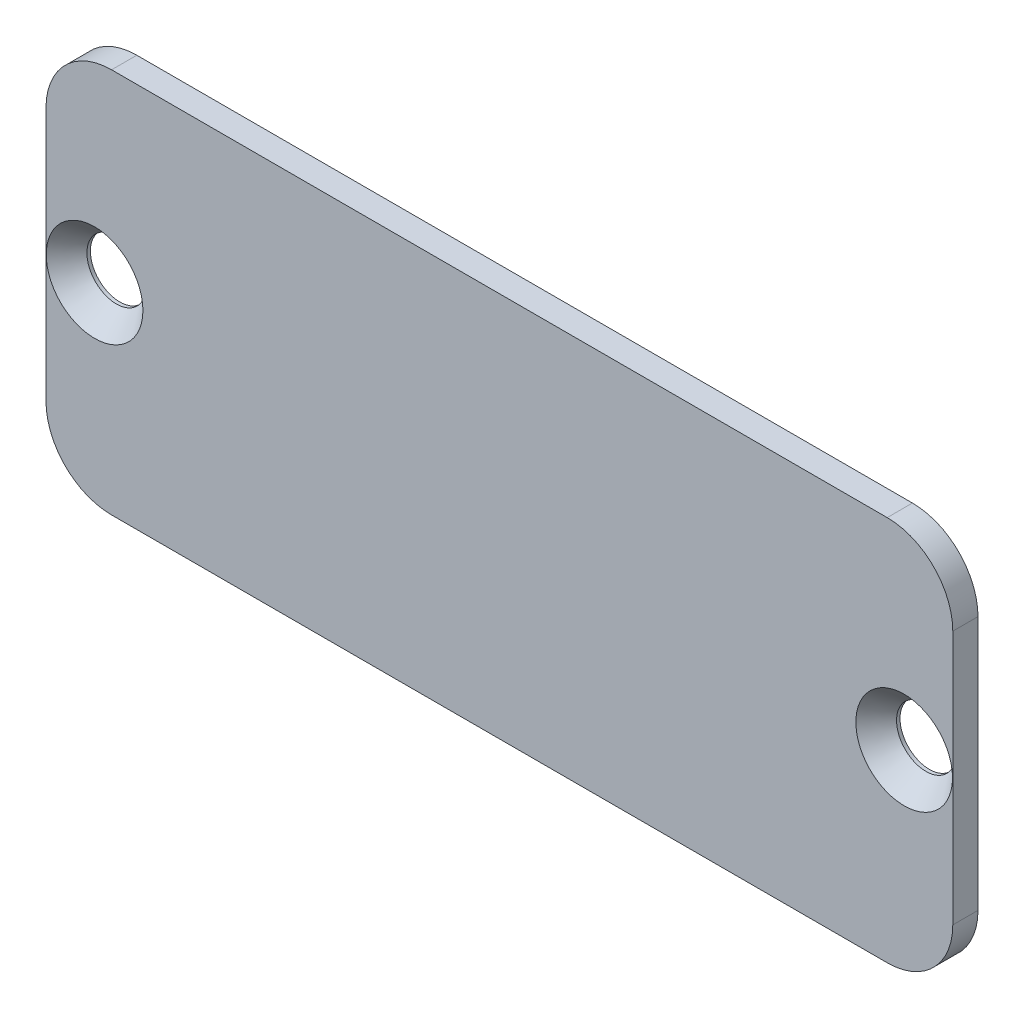
ISO-10303-21;
HEADER;
FILE_DESCRIPTION(('STEP AP214'),'2;1');
FILE_NAME('part.step','',(''),(''),'','','');
FILE_SCHEMA(('AUTOMOTIVE_DESIGN { 1 0 10303 214 1 1 1 1 }'));
ENDSEC;
DATA;
#1=APPLICATION_CONTEXT('core data for automotive mechanical design processes');
#2=APPLICATION_PROTOCOL_DEFINITION('international standard','automotive_design',2000,#1);
#3=PRODUCT_CONTEXT('',#1,'mechanical');
#4=PRODUCT('Part','Part','',(#3));
#5=PRODUCT_RELATED_PRODUCT_CATEGORY('part','',(#4));
#6=PRODUCT_DEFINITION_FORMATION('','',#4);
#7=PRODUCT_DEFINITION_CONTEXT('part definition',#1,'design');
#8=PRODUCT_DEFINITION('design','',#6,#7);
#9=PRODUCT_DEFINITION_SHAPE('','',#8);
#10=(LENGTH_UNIT() NAMED_UNIT(*) SI_UNIT(.MILLI.,.METRE.));
#11=(NAMED_UNIT(*) PLANE_ANGLE_UNIT() SI_UNIT($,.RADIAN.));
#12=(NAMED_UNIT(*) SI_UNIT($,.STERADIAN.) SOLID_ANGLE_UNIT());
#13=UNCERTAINTY_MEASURE_WITH_UNIT(LENGTH_MEASURE(1.E-05),#10,'distance_accuracy_value','');
#14=(GEOMETRIC_REPRESENTATION_CONTEXT(3) GLOBAL_UNCERTAINTY_ASSIGNED_CONTEXT((#13)) GLOBAL_UNIT_ASSIGNED_CONTEXT((#10,
#11,#12)) REPRESENTATION_CONTEXT('',''));
#15=CARTESIAN_POINT('',(0.,0.,0.));
#16=DIRECTION('',(0.,0.,1.));
#17=DIRECTION('',(1.,0.,0.));
#18=AXIS2_PLACEMENT_3D('',#15,#16,#17);
#19=CARTESIAN_POINT('',(0.,0.,1.49999999999999));
#20=DIRECTION('',(0.,0.,1.));
#21=DIRECTION('',(1.,0.,0.));
#22=AXIS2_PLACEMENT_3D('',#19,#20,#21);
#23=PLANE('',#22);
#24=CARTESIAN_POINT('',(24.0755,0.,1.50000000041928));
#25=DIRECTION('',(0.,0.,1.));
#26=DIRECTION('',(1.,0.,0.));
#27=AXIS2_PLACEMENT_3D('',#24,#25,#26);
#28=CIRCLE('',#27,2.87499999954334);
#29=CARTESIAN_POINT('',(26.9504999995434,0.,1.50000000041928));
#30=VERTEX_POINT('',#29);
#31=EDGE_CURVE('E100',#30,#30,#28,.F.);
#32=ORIENTED_EDGE('',*,*,#31,.T.);
#33=EDGE_LOOP('',(#32));
#34=FACE_BOUND('',#33,.T.);
#35=CARTESIAN_POINT('',(-24.0755,0.,1.50000000041928));
#36=DIRECTION('',(0.,0.,1.));
#37=DIRECTION('',(1.,0.,0.));
#38=AXIS2_PLACEMENT_3D('',#35,#36,#37);
#39=CIRCLE('',#38,2.87499999952489);
#40=CARTESIAN_POINT('',(-21.2005000004751,0.,1.50000000041928));
#41=VERTEX_POINT('',#40);
#42=EDGE_CURVE('E18',#41,#41,#39,.F.);
#43=ORIENTED_EDGE('',*,*,#42,.T.);
#44=EDGE_LOOP('',(#43));
#45=FACE_BOUND('',#44,.T.);
#46=DIRECTION('',(0.,1.,0.));
#47=VECTOR('',#46,1.);
#48=CARTESIAN_POINT('',(26.965,7.56500000000002,1.49999999999999));
#49=LINE('',#48,#47);
#50=CARTESIAN_POINT('',(26.965,7.56500000000002,1.49999999999999));
#51=VERTEX_POINT('',#50);
#52=CARTESIAN_POINT('',(26.965,-7.56500000000002,1.49999999999999));
#53=VERTEX_POINT('',#52);
#54=EDGE_CURVE('E114',#51,#53,#49,.F.);
#55=ORIENTED_EDGE('',*,*,#54,.F.);
#56=CARTESIAN_POINT('',(23.065,7.56500000000002,1.49999999999999));
#57=DIRECTION('',(0.,0.,1.));
#58=DIRECTION('',(1.,0.,0.));
#59=AXIS2_PLACEMENT_3D('',#56,#57,#58);
#60=CIRCLE('',#59,3.9);
#61=CARTESIAN_POINT('',(23.065,11.465,1.49999999999999));
#62=VERTEX_POINT('',#61);
#63=EDGE_CURVE('E134',#62,#51,#60,.F.);
#64=ORIENTED_EDGE('',*,*,#63,.F.);
#65=DIRECTION('',(1.,0.,0.));
#66=VECTOR('',#65,1.);
#67=CARTESIAN_POINT('',(0.,11.465,1.49999999999999));
#68=LINE('',#67,#66);
#69=CARTESIAN_POINT('',(-23.065,11.465,1.49999999999999));
#70=VERTEX_POINT('',#69);
#71=EDGE_CURVE('E110',#70,#62,#68,.T.);
#72=ORIENTED_EDGE('',*,*,#71,.F.);
#73=CARTESIAN_POINT('',(-23.065,7.56500000000002,1.49999999999999));
#74=DIRECTION('',(0.,0.,1.));
#75=DIRECTION('',(1.,0.,0.));
#76=AXIS2_PLACEMENT_3D('',#73,#74,#75);
#77=CIRCLE('',#76,3.9);
#78=CARTESIAN_POINT('',(-26.965,7.56500000000002,1.49999999999999));
#79=VERTEX_POINT('',#78);
#80=EDGE_CURVE('E96',#79,#70,#77,.F.);
#81=ORIENTED_EDGE('',*,*,#80,.F.);
#82=DIRECTION('',(0.,1.,0.));
#83=VECTOR('',#82,1.);
#84=CARTESIAN_POINT('',(-26.965,0.,1.49999999999999));
#85=LINE('',#84,#83);
#86=CARTESIAN_POINT('',(-26.965,-7.56500000000002,1.49999999999999));
#87=VERTEX_POINT('',#86);
#88=EDGE_CURVE('E91',#87,#79,#85,.T.);
#89=ORIENTED_EDGE('',*,*,#88,.F.);
#90=CARTESIAN_POINT('',(-23.065,-7.56500000000002,1.49999999999999));
#91=DIRECTION('',(0.,0.,1.));
#92=DIRECTION('',(1.,0.,0.));
#93=AXIS2_PLACEMENT_3D('',#90,#91,#92);
#94=CIRCLE('',#93,3.9);
#95=CARTESIAN_POINT('',(-23.065,-11.465,1.49999999999999));
#96=VERTEX_POINT('',#95);
#97=EDGE_CURVE('E82',#96,#87,#94,.F.);
#98=ORIENTED_EDGE('',*,*,#97,.F.);
#99=DIRECTION('',(1.,0.,0.));
#100=VECTOR('',#99,1.);
#101=CARTESIAN_POINT('',(23.065,-11.465,1.49999999999999));
#102=LINE('',#101,#100);
#103=CARTESIAN_POINT('',(23.065,-11.465,1.49999999999999));
#104=VERTEX_POINT('',#103);
#105=EDGE_CURVE('E77',#104,#96,#102,.F.);
#106=ORIENTED_EDGE('',*,*,#105,.F.);
#107=CARTESIAN_POINT('',(23.065,-7.56500000000002,1.49999999999999));
#108=DIRECTION('',(0.,0.,1.));
#109=DIRECTION('',(1.,0.,0.));
#110=AXIS2_PLACEMENT_3D('',#107,#108,#109);
#111=CIRCLE('',#110,3.9);
#112=EDGE_CURVE('E136',#53,#104,#111,.F.);
#113=ORIENTED_EDGE('',*,*,#112,.F.);
#114=EDGE_LOOP('',(#55,#64,#72,#81,#89,#98,#106,#113));
#115=FACE_BOUND('',#114,.T.);
#116=ADVANCED_FACE('F15',(#34,#45,#115),#23,.T.);
#117=CARTESIAN_POINT('',(-24.0755,0.,1.50000000041928));
#118=DIRECTION('',(0.,0.,1.));
#119=DIRECTION('',(1.,0.,0.));
#120=AXIS2_PLACEMENT_3D('',#117,#118,#119);
#121=CONICAL_SURFACE('',#120,2.87499999952489,0.715584992503476);
#122=CARTESIAN_POINT('',(-24.0755,0.,0.205835541876351));
#123=DIRECTION('',(0.,0.,1.));
#124=DIRECTION('',(1.,0.,0.));
#125=AXIS2_PLACEMENT_3D('',#122,#123,#124);
#126=CIRCLE('',#125,1.75000000000001);
#127=CARTESIAN_POINT('',(-22.3255,0.,0.205835541876351));
#128=VERTEX_POINT('',#127);
#129=EDGE_CURVE('E297',#128,#128,#126,.F.);
#130=ORIENTED_EDGE('',*,*,#129,.T.);
#131=EDGE_LOOP('',(#130));
#132=FACE_BOUND('',#131,.T.);
#133=ORIENTED_EDGE('',*,*,#42,.F.);
#134=EDGE_LOOP('',(#133));
#135=FACE_BOUND('',#134,.T.);
#136=ADVANCED_FACE('F144',(#132,#135),#121,.F.);
#137=CARTESIAN_POINT('',(24.0755,0.,1.50000000041928));
#138=DIRECTION('',(0.,0.,1.));
#139=DIRECTION('',(1.,0.,0.));
#140=AXIS2_PLACEMENT_3D('',#137,#138,#139);
#141=CONICAL_SURFACE('',#140,2.87499999954334,0.715584992503476);
#142=CARTESIAN_POINT('',(24.0755,0.,0.205835541876351));
#143=DIRECTION('',(0.,0.,1.));
#144=DIRECTION('',(1.,0.,0.));
#145=AXIS2_PLACEMENT_3D('',#142,#143,#144);
#146=CIRCLE('',#145,1.75000000000001);
#147=CARTESIAN_POINT('',(25.8255,0.,0.205835541876351));
#148=VERTEX_POINT('',#147);
#149=EDGE_CURVE('E294',#148,#148,#146,.F.);
#150=ORIENTED_EDGE('',*,*,#149,.T.);
#151=EDGE_LOOP('',(#150));
#152=FACE_BOUND('',#151,.T.);
#153=ORIENTED_EDGE('',*,*,#31,.F.);
#154=EDGE_LOOP('',(#153));
#155=FACE_BOUND('',#154,.T.);
#156=ADVANCED_FACE('F146',(#152,#155),#141,.F.);
#157=CARTESIAN_POINT('',(-26.965,0.,0.));
#158=DIRECTION('',(-1.,0.,0.));
#159=DIRECTION('',(0.,0.,1.));
#160=AXIS2_PLACEMENT_3D('',#157,#158,#159);
#161=PLANE('',#160);
#162=DIRECTION('',(0.,1.,0.));
#163=VECTOR('',#162,1.);
#164=CARTESIAN_POINT('',(-26.965,0.,0.));
#165=LINE('',#164,#163);
#166=CARTESIAN_POINT('',(-26.965,7.56500000000002,0.));
#167=VERTEX_POINT('',#166);
#168=CARTESIAN_POINT('',(-26.965,-7.56500000000002,0.));
#169=VERTEX_POINT('',#168);
#170=EDGE_CURVE('E104',#167,#169,#165,.F.);
#171=ORIENTED_EDGE('',*,*,#170,.T.);
#172=DIRECTION('',(0.,0.,1.));
#173=VECTOR('',#172,1.);
#174=CARTESIAN_POINT('',(-26.965,-7.56500000000002,0.));
#175=LINE('',#174,#173);
#176=EDGE_CURVE('E87',#87,#169,#175,.F.);
#177=ORIENTED_EDGE('',*,*,#176,.F.);
#178=ORIENTED_EDGE('',*,*,#88,.T.);
#179=DIRECTION('',(0.,0.,1.));
#180=VECTOR('',#179,1.);
#181=CARTESIAN_POINT('',(-26.965,7.56500000000002,0.));
#182=LINE('',#181,#180);
#183=EDGE_CURVE('E301',#167,#79,#182,.T.);
#184=ORIENTED_EDGE('',*,*,#183,.F.);
#185=EDGE_LOOP('',(#171,#177,#178,#184));
#186=FACE_BOUND('',#185,.T.);
#187=ADVANCED_FACE('F103',(#186),#161,.T.);
#188=CARTESIAN_POINT('',(-23.065,-7.56500000000002,0.));
#189=DIRECTION('',(0.,0.,1.));
#190=DIRECTION('',(1.,0.,0.));
#191=AXIS2_PLACEMENT_3D('',#188,#189,#190);
#192=CYLINDRICAL_SURFACE('',#191,3.9);
#193=CARTESIAN_POINT('',(-23.065,-7.56500000000002,0.));
#194=DIRECTION('',(0.,0.,1.));
#195=DIRECTION('',(1.,0.,0.));
#196=AXIS2_PLACEMENT_3D('',#193,#194,#195);
#197=CIRCLE('',#196,3.9);
#198=CARTESIAN_POINT('',(-23.065,-11.465,0.));
#199=VERTEX_POINT('',#198);
#200=EDGE_CURVE('E131',#169,#199,#197,.T.);
#201=ORIENTED_EDGE('',*,*,#200,.T.);
#202=DIRECTION('',(0.,0.,-1.));
#203=VECTOR('',#202,1.);
#204=CARTESIAN_POINT('',(-23.065,-11.465,0.));
#205=LINE('',#204,#203);
#206=EDGE_CURVE('E89',#96,#199,#205,.T.);
#207=ORIENTED_EDGE('',*,*,#206,.F.);
#208=ORIENTED_EDGE('',*,*,#97,.T.);
#209=ORIENTED_EDGE('',*,*,#176,.T.);
#210=EDGE_LOOP('',(#201,#207,#208,#209));
#211=FACE_BOUND('',#210,.T.);
#212=ADVANCED_FACE('F85',(#211),#192,.T.);
#213=CARTESIAN_POINT('',(23.065,-11.465,0.));
#214=DIRECTION('',(0.,-1.,0.));
#215=DIRECTION('',(0.,0.,-1.));
#216=AXIS2_PLACEMENT_3D('',#213,#214,#215);
#217=PLANE('',#216);
#218=DIRECTION('',(1.,0.,0.));
#219=VECTOR('',#218,1.);
#220=CARTESIAN_POINT('',(0.,-11.465,0.));
#221=LINE('',#220,#219);
#222=CARTESIAN_POINT('',(23.065,-11.465,0.));
#223=VERTEX_POINT('',#222);
#224=EDGE_CURVE('E130',#199,#223,#221,.T.);
#225=ORIENTED_EDGE('',*,*,#224,.T.);
#226=DIRECTION('',(0.,0.,1.));
#227=VECTOR('',#226,1.);
#228=CARTESIAN_POINT('',(23.065,-11.465,0.));
#229=LINE('',#228,#227);
#230=EDGE_CURVE('E116',#104,#223,#229,.F.);
#231=ORIENTED_EDGE('',*,*,#230,.F.);
#232=ORIENTED_EDGE('',*,*,#105,.T.);
#233=ORIENTED_EDGE('',*,*,#206,.T.);
#234=EDGE_LOOP('',(#225,#231,#232,#233));
#235=FACE_BOUND('',#234,.T.);
#236=ADVANCED_FACE('F191',(#235),#217,.T.);
#237=CARTESIAN_POINT('',(23.065,-7.56500000000002,0.));
#238=DIRECTION('',(0.,0.,1.));
#239=DIRECTION('',(1.,0.,0.));
#240=AXIS2_PLACEMENT_3D('',#237,#238,#239);
#241=CYLINDRICAL_SURFACE('',#240,3.9);
#242=CARTESIAN_POINT('',(23.065,-7.56500000000002,0.));
#243=DIRECTION('',(0.,0.,1.));
#244=DIRECTION('',(1.,0.,0.));
#245=AXIS2_PLACEMENT_3D('',#242,#243,#244);
#246=CIRCLE('',#245,3.9);
#247=CARTESIAN_POINT('',(26.965,-7.56500000000002,0.));
#248=VERTEX_POINT('',#247);
#249=EDGE_CURVE('E127',#223,#248,#246,.T.);
#250=ORIENTED_EDGE('',*,*,#249,.T.);
#251=DIRECTION('',(0.,0.,-1.));
#252=VECTOR('',#251,1.);
#253=CARTESIAN_POINT('',(26.965,-7.56500000000002,0.));
#254=LINE('',#253,#252);
#255=EDGE_CURVE('E115',#53,#248,#254,.T.);
#256=ORIENTED_EDGE('',*,*,#255,.F.);
#257=ORIENTED_EDGE('',*,*,#112,.T.);
#258=ORIENTED_EDGE('',*,*,#230,.T.);
#259=EDGE_LOOP('',(#250,#256,#257,#258));
#260=FACE_BOUND('',#259,.T.);
#261=ADVANCED_FACE('F187',(#260),#241,.T.);
#262=CARTESIAN_POINT('',(26.965,7.56500000000002,0.));
#263=DIRECTION('',(1.,0.,0.));
#264=DIRECTION('',(0.,0.,-1.));
#265=AXIS2_PLACEMENT_3D('',#262,#263,#264);
#266=PLANE('',#265);
#267=DIRECTION('',(0.,1.,0.));
#268=VECTOR('',#267,1.);
#269=CARTESIAN_POINT('',(26.965,0.,0.));
#270=LINE('',#269,#268);
#271=CARTESIAN_POINT('',(26.965,7.56500000000002,0.));
#272=VERTEX_POINT('',#271);
#273=EDGE_CURVE('E126',#248,#272,#270,.T.);
#274=ORIENTED_EDGE('',*,*,#273,.T.);
#275=DIRECTION('',(0.,0.,1.));
#276=VECTOR('',#275,1.);
#277=CARTESIAN_POINT('',(26.965,7.56500000000002,0.));
#278=LINE('',#277,#276);
#279=EDGE_CURVE('E113',#51,#272,#278,.F.);
#280=ORIENTED_EDGE('',*,*,#279,.F.);
#281=ORIENTED_EDGE('',*,*,#54,.T.);
#282=ORIENTED_EDGE('',*,*,#255,.T.);
#283=EDGE_LOOP('',(#274,#280,#281,#282));
#284=FACE_BOUND('',#283,.T.);
#285=ADVANCED_FACE('F183',(#284),#266,.T.);
#286=CARTESIAN_POINT('',(23.065,7.56500000000002,0.));
#287=DIRECTION('',(0.,0.,1.));
#288=DIRECTION('',(1.,0.,0.));
#289=AXIS2_PLACEMENT_3D('',#286,#287,#288);
#290=CYLINDRICAL_SURFACE('',#289,3.9);
#291=CARTESIAN_POINT('',(23.065,7.56500000000002,0.));
#292=DIRECTION('',(0.,0.,1.));
#293=DIRECTION('',(1.,0.,0.));
#294=AXIS2_PLACEMENT_3D('',#291,#292,#293);
#295=CIRCLE('',#294,3.9);
#296=CARTESIAN_POINT('',(23.065,11.465,0.));
#297=VERTEX_POINT('',#296);
#298=EDGE_CURVE('E123',#272,#297,#295,.T.);
#299=ORIENTED_EDGE('',*,*,#298,.T.);
#300=DIRECTION('',(0.,0.,1.));
#301=VECTOR('',#300,1.);
#302=CARTESIAN_POINT('',(23.065,11.465,0.));
#303=LINE('',#302,#301);
#304=EDGE_CURVE('E112',#62,#297,#303,.F.);
#305=ORIENTED_EDGE('',*,*,#304,.F.);
#306=ORIENTED_EDGE('',*,*,#63,.T.);
#307=ORIENTED_EDGE('',*,*,#279,.T.);
#308=EDGE_LOOP('',(#299,#305,#306,#307));
#309=FACE_BOUND('',#308,.T.);
#310=ADVANCED_FACE('F179',(#309),#290,.T.);
#311=CARTESIAN_POINT('',(0.,11.465,0.));
#312=DIRECTION('',(0.,1.,0.));
#313=DIRECTION('',(0.,0.,1.));
#314=AXIS2_PLACEMENT_3D('',#311,#312,#313);
#315=PLANE('',#314);
#316=DIRECTION('',(1.,0.,0.));
#317=VECTOR('',#316,1.);
#318=CARTESIAN_POINT('',(0.,11.465,0.));
#319=LINE('',#318,#317);
#320=CARTESIAN_POINT('',(-23.065,11.465,0.));
#321=VERTEX_POINT('',#320);
#322=EDGE_CURVE('E122',#297,#321,#319,.F.);
#323=ORIENTED_EDGE('',*,*,#322,.T.);
#324=DIRECTION('',(0.,0.,1.));
#325=VECTOR('',#324,1.);
#326=CARTESIAN_POINT('',(-23.065,11.465,0.));
#327=LINE('',#326,#325);
#328=EDGE_CURVE('E33',#70,#321,#327,.F.);
#329=ORIENTED_EDGE('',*,*,#328,.F.);
#330=ORIENTED_EDGE('',*,*,#71,.T.);
#331=ORIENTED_EDGE('',*,*,#304,.T.);
#332=EDGE_LOOP('',(#323,#329,#330,#331));
#333=FACE_BOUND('',#332,.T.);
#334=ADVANCED_FACE('F176',(#333),#315,.T.);
#335=CARTESIAN_POINT('',(-23.065,7.56500000000002,0.));
#336=DIRECTION('',(0.,0.,1.));
#337=DIRECTION('',(1.,0.,0.));
#338=AXIS2_PLACEMENT_3D('',#335,#336,#337);
#339=CYLINDRICAL_SURFACE('',#338,3.9);
#340=CARTESIAN_POINT('',(-23.065,7.56500000000002,0.));
#341=DIRECTION('',(0.,0.,1.));
#342=DIRECTION('',(1.,0.,0.));
#343=AXIS2_PLACEMENT_3D('',#340,#341,#342);
#344=CIRCLE('',#343,3.9);
#345=EDGE_CURVE('E120',#321,#167,#344,.T.);
#346=ORIENTED_EDGE('',*,*,#345,.T.);
#347=ORIENTED_EDGE('',*,*,#183,.T.);
#348=ORIENTED_EDGE('',*,*,#80,.T.);
#349=ORIENTED_EDGE('',*,*,#328,.T.);
#350=EDGE_LOOP('',(#346,#347,#348,#349));
#351=FACE_BOUND('',#350,.T.);
#352=ADVANCED_FACE('F172',(#351),#339,.T.);
#353=CARTESIAN_POINT('',(-24.0755,0.,-57.1214960573338));
#354=DIRECTION('',(0.,0.,1.));
#355=DIRECTION('',(1.,0.,0.));
#356=AXIS2_PLACEMENT_3D('',#353,#354,#355);
#357=CYLINDRICAL_SURFACE('',#356,1.75000000000001);
#358=ORIENTED_EDGE('',*,*,#129,.F.);
#359=EDGE_LOOP('',(#358));
#360=FACE_BOUND('',#359,.T.);
#361=CARTESIAN_POINT('',(-24.0755,0.,0.));
#362=DIRECTION('',(0.,0.,1.));
#363=DIRECTION('',(1.,0.,0.));
#364=AXIS2_PLACEMENT_3D('',#361,#362,#363);
#365=CIRCLE('',#364,1.75000000000001);
#366=CARTESIAN_POINT('',(-22.3255,0.,0.));
#367=VERTEX_POINT('',#366);
#368=EDGE_CURVE('E24',#367,#367,#365,.F.);
#369=ORIENTED_EDGE('',*,*,#368,.T.);
#370=EDGE_LOOP('',(#369));
#371=FACE_BOUND('',#370,.T.);
#372=ADVANCED_FACE('F164',(#360,#371),#357,.F.);
#373=CARTESIAN_POINT('',(24.0755,0.,-57.1214960573338));
#374=DIRECTION('',(0.,0.,1.));
#375=DIRECTION('',(1.,0.,0.));
#376=AXIS2_PLACEMENT_3D('',#373,#374,#375);
#377=CYLINDRICAL_SURFACE('',#376,1.75000000000001);
#378=ORIENTED_EDGE('',*,*,#149,.F.);
#379=EDGE_LOOP('',(#378));
#380=FACE_BOUND('',#379,.T.);
#381=CARTESIAN_POINT('',(24.0755,0.,0.));
#382=DIRECTION('',(0.,0.,1.));
#383=DIRECTION('',(1.,0.,0.));
#384=AXIS2_PLACEMENT_3D('',#381,#382,#383);
#385=CIRCLE('',#384,1.75000000000001);
#386=CARTESIAN_POINT('',(25.8255,0.,0.));
#387=VERTEX_POINT('',#386);
#388=EDGE_CURVE('E10',#387,#387,#385,.F.);
#389=ORIENTED_EDGE('',*,*,#388,.T.);
#390=EDGE_LOOP('',(#389));
#391=FACE_BOUND('',#390,.T.);
#392=ADVANCED_FACE('F158',(#380,#391),#377,.F.);
#393=CARTESIAN_POINT('',(0.,0.,0.));
#394=DIRECTION('',(0.,0.,1.));
#395=DIRECTION('',(1.,0.,0.));
#396=AXIS2_PLACEMENT_3D('',#393,#394,#395);
#397=PLANE('',#396);
#398=ORIENTED_EDGE('',*,*,#388,.F.);
#399=EDGE_LOOP('',(#398));
#400=FACE_BOUND('',#399,.T.);
#401=ORIENTED_EDGE('',*,*,#368,.F.);
#402=EDGE_LOOP('',(#401));
#403=FACE_BOUND('',#402,.T.);
#404=ORIENTED_EDGE('',*,*,#322,.F.);
#405=ORIENTED_EDGE('',*,*,#298,.F.);
#406=ORIENTED_EDGE('',*,*,#273,.F.);
#407=ORIENTED_EDGE('',*,*,#249,.F.);
#408=ORIENTED_EDGE('',*,*,#224,.F.);
#409=ORIENTED_EDGE('',*,*,#200,.F.);
#410=ORIENTED_EDGE('',*,*,#170,.F.);
#411=ORIENTED_EDGE('',*,*,#345,.F.);
#412=EDGE_LOOP('',(#404,#405,#406,#407,#408,#409,#410,#411));
#413=FACE_BOUND('',#412,.T.);
#414=ADVANCED_FACE('F156',(#400,#403,#413),#397,.F.);
#415=CLOSED_SHELL('',(#116,#136,#156,#187,#212,#236,#261,#285,#310,#334,#352,#372,#392,#414));
#416=MANIFOLD_SOLID_BREP('B1',#415);
#417=ADVANCED_BREP_SHAPE_REPRESENTATION('',(#18,#416),#14);
#418=SHAPE_DEFINITION_REPRESENTATION(#9,#417);
ENDSEC;
END-ISO-10303-21;
